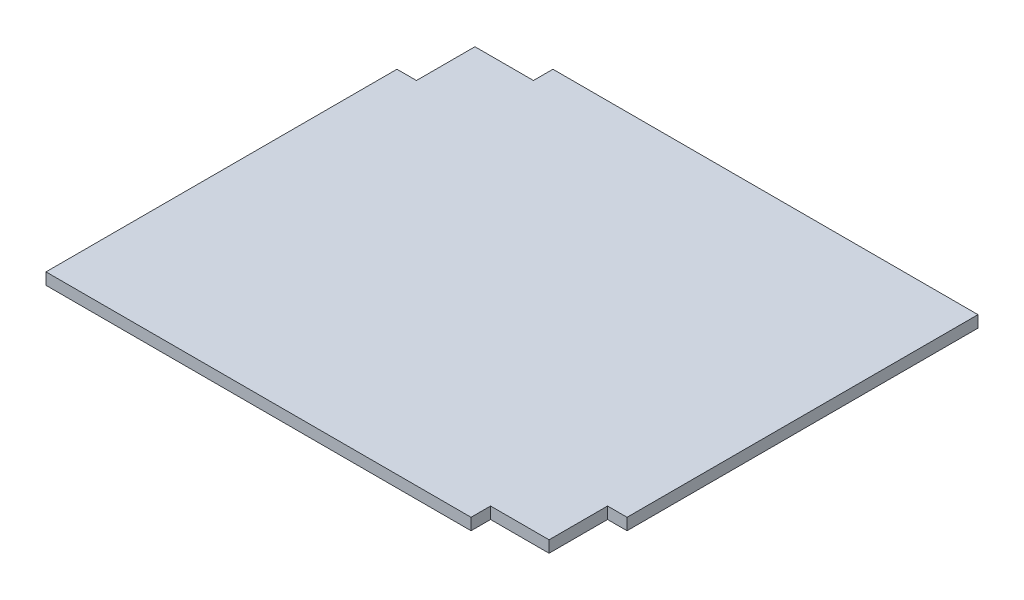
ISO-10303-21;
HEADER;
FILE_DESCRIPTION(('STEP AP214'),'2;1');
FILE_NAME('part.step','',(''),(''),'','','');
FILE_SCHEMA(('AUTOMOTIVE_DESIGN { 1 0 10303 214 1 1 1 1 }'));
ENDSEC;
DATA;
#1=APPLICATION_CONTEXT('core data for automotive mechanical design processes');
#2=APPLICATION_PROTOCOL_DEFINITION('international standard','automotive_design',2000,#1);
#3=PRODUCT_CONTEXT('',#1,'mechanical');
#4=PRODUCT('Part','Part','',(#3));
#5=PRODUCT_RELATED_PRODUCT_CATEGORY('part','',(#4));
#6=PRODUCT_DEFINITION_FORMATION('','',#4);
#7=PRODUCT_DEFINITION_CONTEXT('part definition',#1,'design');
#8=PRODUCT_DEFINITION('design','',#6,#7);
#9=PRODUCT_DEFINITION_SHAPE('','',#8);
#10=(LENGTH_UNIT() NAMED_UNIT(*) SI_UNIT(.MILLI.,.METRE.));
#11=(NAMED_UNIT(*) PLANE_ANGLE_UNIT() SI_UNIT($,.RADIAN.));
#12=(NAMED_UNIT(*) SI_UNIT($,.STERADIAN.) SOLID_ANGLE_UNIT());
#13=UNCERTAINTY_MEASURE_WITH_UNIT(LENGTH_MEASURE(1.E-05),#10,'distance_accuracy_value','');
#14=(GEOMETRIC_REPRESENTATION_CONTEXT(3) GLOBAL_UNCERTAINTY_ASSIGNED_CONTEXT((#13)) GLOBAL_UNIT_ASSIGNED_CONTEXT((#10,
#11,#12)) REPRESENTATION_CONTEXT('',''));
#15=CARTESIAN_POINT('',(0.,0.,0.));
#16=DIRECTION('',(0.,0.,1.));
#17=DIRECTION('',(1.,0.,0.));
#18=AXIS2_PLACEMENT_3D('',#15,#16,#17);
#19=CARTESIAN_POINT('',(32.25,1.5,-27.5));
#20=DIRECTION('',(0.,0.,1.));
#21=DIRECTION('',(1.,0.,0.));
#22=AXIS2_PLACEMENT_3D('',#19,#20,#21);
#23=PLANE('',#22);
#24=DIRECTION('',(-1.,0.,0.));
#25=VECTOR('',#24,1.);
#26=CARTESIAN_POINT('',(32.25,0.,-27.5));
#27=LINE('',#26,#25);
#28=CARTESIAN_POINT('',(32.25,0.,-27.5));
#29=VERTEX_POINT('',#28);
#30=CARTESIAN_POINT('',(-22.25,0.,-27.5));
#31=VERTEX_POINT('',#30);
#32=EDGE_CURVE('E164',#29,#31,#27,.T.);
#33=ORIENTED_EDGE('',*,*,#32,.T.);
#34=DIRECTION('',(0.,-1.,0.));
#35=VECTOR('',#34,1.);
#36=CARTESIAN_POINT('',(-22.25,1.5,-27.5));
#37=LINE('',#36,#35);
#38=CARTESIAN_POINT('',(-22.25,1.5,-27.5));
#39=VERTEX_POINT('',#38);
#40=EDGE_CURVE('E11',#39,#31,#37,.T.);
#41=ORIENTED_EDGE('',*,*,#40,.F.);
#42=DIRECTION('',(-1.,0.,0.));
#43=VECTOR('',#42,1.);
#44=CARTESIAN_POINT('',(32.25,1.5,-27.5));
#45=LINE('',#44,#43);
#46=CARTESIAN_POINT('',(32.25,1.5,-27.5));
#47=VERTEX_POINT('',#46);
#48=EDGE_CURVE('E198',#47,#39,#45,.T.);
#49=ORIENTED_EDGE('',*,*,#48,.F.);
#50=DIRECTION('',(0.,-1.,0.));
#51=VECTOR('',#50,1.);
#52=CARTESIAN_POINT('',(32.25,1.5,-27.5));
#53=LINE('',#52,#51);
#54=EDGE_CURVE('E160',#47,#29,#53,.T.);
#55=ORIENTED_EDGE('',*,*,#54,.T.);
#56=EDGE_LOOP('',(#33,#41,#49,#55));
#57=FACE_BOUND('',#56,.T.);
#58=ADVANCED_FACE('F39',(#57),#23,.F.);
#59=CARTESIAN_POINT('',(-22.25,1.5,-27.5));
#60=DIRECTION('',(1.,0.,0.));
#61=DIRECTION('',(0.,0.,-1.));
#62=AXIS2_PLACEMENT_3D('',#59,#60,#61);
#63=PLANE('',#62);
#64=DIRECTION('',(0.,0.,1.));
#65=VECTOR('',#64,1.);
#66=CARTESIAN_POINT('',(-22.25,0.,-27.5));
#67=LINE('',#66,#65);
#68=CARTESIAN_POINT('',(-22.25,0.,-25.));
#69=VERTEX_POINT('',#68);
#70=EDGE_CURVE('E168',#31,#69,#67,.T.);
#71=ORIENTED_EDGE('',*,*,#70,.T.);
#72=DIRECTION('',(0.,-1.,0.));
#73=VECTOR('',#72,1.);
#74=CARTESIAN_POINT('',(-22.25,1.5,-25.));
#75=LINE('',#74,#73);
#76=CARTESIAN_POINT('',(-22.25,1.5,-25.));
#77=VERTEX_POINT('',#76);
#78=EDGE_CURVE('E48',#77,#69,#75,.T.);
#79=ORIENTED_EDGE('',*,*,#78,.F.);
#80=DIRECTION('',(0.,0.,1.));
#81=VECTOR('',#80,1.);
#82=CARTESIAN_POINT('',(-22.25,1.5,-27.5));
#83=LINE('',#82,#81);
#84=EDGE_CURVE('E111',#39,#77,#83,.T.);
#85=ORIENTED_EDGE('',*,*,#84,.F.);
#86=ORIENTED_EDGE('',*,*,#40,.T.);
#87=EDGE_LOOP('',(#71,#79,#85,#86));
#88=FACE_BOUND('',#87,.T.);
#89=ADVANCED_FACE('F292',(#88),#63,.F.);
#90=CARTESIAN_POINT('',(-29.75,1.5,-25.));
#91=DIRECTION('',(0.,0.,1.));
#92=DIRECTION('',(1.,0.,0.));
#93=AXIS2_PLACEMENT_3D('',#90,#91,#92);
#94=PLANE('',#93);
#95=DIRECTION('',(-1.,0.,0.));
#96=VECTOR('',#95,1.);
#97=CARTESIAN_POINT('',(-29.75,0.,-25.));
#98=LINE('',#97,#96);
#99=CARTESIAN_POINT('',(-29.75,0.,-25.));
#100=VERTEX_POINT('',#99);
#101=EDGE_CURVE('E171',#69,#100,#98,.T.);
#102=ORIENTED_EDGE('',*,*,#101,.T.);
#103=DIRECTION('',(0.,-1.,0.));
#104=VECTOR('',#103,1.);
#105=CARTESIAN_POINT('',(-29.75,1.5,-25.));
#106=LINE('',#105,#104);
#107=CARTESIAN_POINT('',(-29.75,1.5,-25.));
#108=VERTEX_POINT('',#107);
#109=EDGE_CURVE('E225',#108,#100,#106,.T.);
#110=ORIENTED_EDGE('',*,*,#109,.F.);
#111=DIRECTION('',(-1.,0.,0.));
#112=VECTOR('',#111,1.);
#113=CARTESIAN_POINT('',(-29.75,1.5,-25.));
#114=LINE('',#113,#112);
#115=EDGE_CURVE('E235',#77,#108,#114,.T.);
#116=ORIENTED_EDGE('',*,*,#115,.F.);
#117=ORIENTED_EDGE('',*,*,#78,.T.);
#118=EDGE_LOOP('',(#102,#110,#116,#117));
#119=FACE_BOUND('',#118,.T.);
#120=ADVANCED_FACE('F233',(#119),#94,.F.);
#121=CARTESIAN_POINT('',(-29.75,1.5,-25.));
#122=DIRECTION('',(1.,0.,0.));
#123=DIRECTION('',(0.,0.,-1.));
#124=AXIS2_PLACEMENT_3D('',#121,#122,#123);
#125=PLANE('',#124);
#126=DIRECTION('',(0.,0.,1.));
#127=VECTOR('',#126,1.);
#128=CARTESIAN_POINT('',(-29.75,0.,-25.));
#129=LINE('',#128,#127);
#130=CARTESIAN_POINT('',(-29.75,0.,-17.5));
#131=VERTEX_POINT('',#130);
#132=EDGE_CURVE('E174',#100,#131,#129,.T.);
#133=ORIENTED_EDGE('',*,*,#132,.T.);
#134=DIRECTION('',(0.,-1.,0.));
#135=VECTOR('',#134,1.);
#136=CARTESIAN_POINT('',(-29.75,1.5,-17.5));
#137=LINE('',#136,#135);
#138=CARTESIAN_POINT('',(-29.75,1.5,-17.5));
#139=VERTEX_POINT('',#138);
#140=EDGE_CURVE('E221',#139,#131,#137,.T.);
#141=ORIENTED_EDGE('',*,*,#140,.F.);
#142=DIRECTION('',(0.,0.,1.));
#143=VECTOR('',#142,1.);
#144=CARTESIAN_POINT('',(-29.75,1.5,-25.));
#145=LINE('',#144,#143);
#146=EDGE_CURVE('E254',#108,#139,#145,.T.);
#147=ORIENTED_EDGE('',*,*,#146,.F.);
#148=ORIENTED_EDGE('',*,*,#109,.T.);
#149=EDGE_LOOP('',(#133,#141,#147,#148));
#150=FACE_BOUND('',#149,.T.);
#151=ADVANCED_FACE('F244',(#150),#125,.F.);
#152=CARTESIAN_POINT('',(-32.25,1.5,-17.5));
#153=DIRECTION('',(0.,0.,1.));
#154=DIRECTION('',(1.,0.,0.));
#155=AXIS2_PLACEMENT_3D('',#152,#153,#154);
#156=PLANE('',#155);
#157=DIRECTION('',(-1.,0.,0.));
#158=VECTOR('',#157,1.);
#159=CARTESIAN_POINT('',(-32.25,0.,-17.5));
#160=LINE('',#159,#158);
#161=CARTESIAN_POINT('',(-32.25,0.,-17.5));
#162=VERTEX_POINT('',#161);
#163=EDGE_CURVE('E177',#131,#162,#160,.T.);
#164=ORIENTED_EDGE('',*,*,#163,.T.);
#165=DIRECTION('',(0.,-1.,0.));
#166=VECTOR('',#165,1.);
#167=CARTESIAN_POINT('',(-32.25,1.5,-17.5));
#168=LINE('',#167,#166);
#169=CARTESIAN_POINT('',(-32.25,1.5,-17.5));
#170=VERTEX_POINT('',#169);
#171=EDGE_CURVE('E217',#170,#162,#168,.T.);
#172=ORIENTED_EDGE('',*,*,#171,.F.);
#173=DIRECTION('',(-1.,0.,0.));
#174=VECTOR('',#173,1.);
#175=CARTESIAN_POINT('',(-32.25,1.5,-17.5));
#176=LINE('',#175,#174);
#177=EDGE_CURVE('E250',#139,#170,#176,.T.);
#178=ORIENTED_EDGE('',*,*,#177,.F.);
#179=ORIENTED_EDGE('',*,*,#140,.T.);
#180=EDGE_LOOP('',(#164,#172,#178,#179));
#181=FACE_BOUND('',#180,.T.);
#182=ADVANCED_FACE('F248',(#181),#156,.F.);
#183=CARTESIAN_POINT('',(-32.25,1.5,27.5));
#184=DIRECTION('',(1.,0.,0.));
#185=DIRECTION('',(0.,0.,-1.));
#186=AXIS2_PLACEMENT_3D('',#183,#184,#185);
#187=PLANE('',#186);
#188=DIRECTION('',(0.,0.,1.));
#189=VECTOR('',#188,1.);
#190=CARTESIAN_POINT('',(-32.25,0.,27.5));
#191=LINE('',#190,#189);
#192=CARTESIAN_POINT('',(-32.25,0.,27.5));
#193=VERTEX_POINT('',#192);
#194=EDGE_CURVE('E180',#162,#193,#191,.T.);
#195=ORIENTED_EDGE('',*,*,#194,.T.);
#196=DIRECTION('',(0.,-1.,0.));
#197=VECTOR('',#196,1.);
#198=CARTESIAN_POINT('',(-32.25,1.5,27.5));
#199=LINE('',#198,#197);
#200=CARTESIAN_POINT('',(-32.25,1.5,27.5));
#201=VERTEX_POINT('',#200);
#202=EDGE_CURVE('E213',#201,#193,#199,.T.);
#203=ORIENTED_EDGE('',*,*,#202,.F.);
#204=DIRECTION('',(0.,0.,1.));
#205=VECTOR('',#204,1.);
#206=CARTESIAN_POINT('',(-32.25,1.5,27.5));
#207=LINE('',#206,#205);
#208=EDGE_CURVE('E253',#170,#201,#207,.T.);
#209=ORIENTED_EDGE('',*,*,#208,.F.);
#210=ORIENTED_EDGE('',*,*,#171,.T.);
#211=EDGE_LOOP('',(#195,#203,#209,#210));
#212=FACE_BOUND('',#211,.T.);
#213=ADVANCED_FACE('F305',(#212),#187,.F.);
#214=CARTESIAN_POINT('',(22.25,1.5,27.5));
#215=DIRECTION('',(0.,0.,-1.));
#216=DIRECTION('',(-1.,0.,0.));
#217=AXIS2_PLACEMENT_3D('',#214,#215,#216);
#218=PLANE('',#217);
#219=DIRECTION('',(1.,0.,0.));
#220=VECTOR('',#219,1.);
#221=CARTESIAN_POINT('',(22.25,0.,27.5));
#222=LINE('',#221,#220);
#223=CARTESIAN_POINT('',(22.25,0.,27.5));
#224=VERTEX_POINT('',#223);
#225=EDGE_CURVE('E183',#193,#224,#222,.T.);
#226=ORIENTED_EDGE('',*,*,#225,.T.);
#227=DIRECTION('',(0.,-1.,0.));
#228=VECTOR('',#227,1.);
#229=CARTESIAN_POINT('',(22.25,1.5,27.5));
#230=LINE('',#229,#228);
#231=CARTESIAN_POINT('',(22.25,1.5,27.5));
#232=VERTEX_POINT('',#231);
#233=EDGE_CURVE('E209',#232,#224,#230,.T.);
#234=ORIENTED_EDGE('',*,*,#233,.F.);
#235=DIRECTION('',(1.,0.,0.));
#236=VECTOR('',#235,1.);
#237=CARTESIAN_POINT('',(22.25,1.5,27.5));
#238=LINE('',#237,#236);
#239=EDGE_CURVE('E258',#201,#232,#238,.T.);
#240=ORIENTED_EDGE('',*,*,#239,.F.);
#241=ORIENTED_EDGE('',*,*,#202,.T.);
#242=EDGE_LOOP('',(#226,#234,#240,#241));
#243=FACE_BOUND('',#242,.T.);
#244=ADVANCED_FACE('F308',(#243),#218,.F.);
#245=CARTESIAN_POINT('',(22.25,1.5,27.5));
#246=DIRECTION('',(-1.,0.,0.));
#247=DIRECTION('',(0.,0.,1.));
#248=AXIS2_PLACEMENT_3D('',#245,#246,#247);
#249=PLANE('',#248);
#250=DIRECTION('',(0.,0.,-1.));
#251=VECTOR('',#250,1.);
#252=CARTESIAN_POINT('',(22.25,0.,27.5));
#253=LINE('',#252,#251);
#254=CARTESIAN_POINT('',(22.25,0.,25.));
#255=VERTEX_POINT('',#254);
#256=EDGE_CURVE('E186',#224,#255,#253,.T.);
#257=ORIENTED_EDGE('',*,*,#256,.T.);
#258=DIRECTION('',(0.,-1.,0.));
#259=VECTOR('',#258,1.);
#260=CARTESIAN_POINT('',(22.25,1.5,25.));
#261=LINE('',#260,#259);
#262=CARTESIAN_POINT('',(22.25,1.5,25.));
#263=VERTEX_POINT('',#262);
#264=EDGE_CURVE('E205',#263,#255,#261,.T.);
#265=ORIENTED_EDGE('',*,*,#264,.F.);
#266=DIRECTION('',(0.,0.,-1.));
#267=VECTOR('',#266,1.);
#268=CARTESIAN_POINT('',(22.25,1.5,27.5));
#269=LINE('',#268,#267);
#270=EDGE_CURVE('E265',#232,#263,#269,.T.);
#271=ORIENTED_EDGE('',*,*,#270,.F.);
#272=ORIENTED_EDGE('',*,*,#233,.T.);
#273=EDGE_LOOP('',(#257,#265,#271,#272));
#274=FACE_BOUND('',#273,.T.);
#275=ADVANCED_FACE('F273',(#274),#249,.F.);
#276=CARTESIAN_POINT('',(22.25,1.5,25.));
#277=DIRECTION('',(0.,0.,-1.));
#278=DIRECTION('',(-1.,0.,0.));
#279=AXIS2_PLACEMENT_3D('',#276,#277,#278);
#280=PLANE('',#279);
#281=DIRECTION('',(1.,0.,0.));
#282=VECTOR('',#281,1.);
#283=CARTESIAN_POINT('',(22.25,0.,25.));
#284=LINE('',#283,#282);
#285=CARTESIAN_POINT('',(29.75,0.,25.));
#286=VERTEX_POINT('',#285);
#287=EDGE_CURVE('E189',#255,#286,#284,.T.);
#288=ORIENTED_EDGE('',*,*,#287,.T.);
#289=DIRECTION('',(0.,-1.,0.));
#290=VECTOR('',#289,1.);
#291=CARTESIAN_POINT('',(29.75,1.5,25.));
#292=LINE('',#291,#290);
#293=CARTESIAN_POINT('',(29.75,1.5,25.));
#294=VERTEX_POINT('',#293);
#295=EDGE_CURVE('E153',#294,#286,#292,.T.);
#296=ORIENTED_EDGE('',*,*,#295,.F.);
#297=DIRECTION('',(1.,0.,0.));
#298=VECTOR('',#297,1.);
#299=CARTESIAN_POINT('',(22.25,1.5,25.));
#300=LINE('',#299,#298);
#301=EDGE_CURVE('E142',#263,#294,#300,.T.);
#302=ORIENTED_EDGE('',*,*,#301,.F.);
#303=ORIENTED_EDGE('',*,*,#264,.T.);
#304=EDGE_LOOP('',(#288,#296,#302,#303));
#305=FACE_BOUND('',#304,.T.);
#306=ADVANCED_FACE('F277',(#305),#280,.F.);
#307=CARTESIAN_POINT('',(29.75,1.5,25.));
#308=DIRECTION('',(-1.,0.,0.));
#309=DIRECTION('',(0.,0.,1.));
#310=AXIS2_PLACEMENT_3D('',#307,#308,#309);
#311=PLANE('',#310);
#312=DIRECTION('',(0.,0.,-1.));
#313=VECTOR('',#312,1.);
#314=CARTESIAN_POINT('',(29.75,0.,25.));
#315=LINE('',#314,#313);
#316=CARTESIAN_POINT('',(29.75,0.,17.5));
#317=VERTEX_POINT('',#316);
#318=EDGE_CURVE('E151',#286,#317,#315,.T.);
#319=ORIENTED_EDGE('',*,*,#318,.T.);
#320=DIRECTION('',(0.,-1.,0.));
#321=VECTOR('',#320,1.);
#322=CARTESIAN_POINT('',(29.75,1.5,17.5));
#323=LINE('',#322,#321);
#324=CARTESIAN_POINT('',(29.75,1.5,17.5));
#325=VERTEX_POINT('',#324);
#326=EDGE_CURVE('E148',#325,#317,#323,.T.);
#327=ORIENTED_EDGE('',*,*,#326,.F.);
#328=DIRECTION('',(0.,0.,-1.));
#329=VECTOR('',#328,1.);
#330=CARTESIAN_POINT('',(29.75,1.5,25.));
#331=LINE('',#330,#329);
#332=EDGE_CURVE('E136',#294,#325,#331,.T.);
#333=ORIENTED_EDGE('',*,*,#332,.F.);
#334=ORIENTED_EDGE('',*,*,#295,.T.);
#335=EDGE_LOOP('',(#319,#327,#333,#334));
#336=FACE_BOUND('',#335,.T.);
#337=ADVANCED_FACE('F149',(#336),#311,.F.);
#338=CARTESIAN_POINT('',(29.75,1.5,17.5));
#339=DIRECTION('',(0.,0.,-1.));
#340=DIRECTION('',(-1.,0.,0.));
#341=AXIS2_PLACEMENT_3D('',#338,#339,#340);
#342=PLANE('',#341);
#343=DIRECTION('',(1.,0.,0.));
#344=VECTOR('',#343,1.);
#345=CARTESIAN_POINT('',(29.75,0.,17.5));
#346=LINE('',#345,#344);
#347=CARTESIAN_POINT('',(32.25,0.,17.5));
#348=VERTEX_POINT('',#347);
#349=EDGE_CURVE('E97',#317,#348,#346,.T.);
#350=ORIENTED_EDGE('',*,*,#349,.T.);
#351=DIRECTION('',(0.,-1.,0.));
#352=VECTOR('',#351,1.);
#353=CARTESIAN_POINT('',(32.25,1.5,17.5));
#354=LINE('',#353,#352);
#355=CARTESIAN_POINT('',(32.25,1.5,17.5));
#356=VERTEX_POINT('',#355);
#357=EDGE_CURVE('E154',#356,#348,#354,.T.);
#358=ORIENTED_EDGE('',*,*,#357,.F.);
#359=DIRECTION('',(1.,0.,0.));
#360=VECTOR('',#359,1.);
#361=CARTESIAN_POINT('',(29.75,1.5,17.5));
#362=LINE('',#361,#360);
#363=EDGE_CURVE('E140',#325,#356,#362,.T.);
#364=ORIENTED_EDGE('',*,*,#363,.F.);
#365=ORIENTED_EDGE('',*,*,#326,.T.);
#366=EDGE_LOOP('',(#350,#358,#364,#365));
#367=FACE_BOUND('',#366,.T.);
#368=ADVANCED_FACE('F156',(#367),#342,.F.);
#369=CARTESIAN_POINT('',(32.25,1.5,17.5));
#370=DIRECTION('',(-1.,0.,0.));
#371=DIRECTION('',(0.,0.,1.));
#372=AXIS2_PLACEMENT_3D('',#369,#370,#371);
#373=PLANE('',#372);
#374=DIRECTION('',(0.,0.,-1.));
#375=VECTOR('',#374,1.);
#376=CARTESIAN_POINT('',(32.25,0.,17.5));
#377=LINE('',#376,#375);
#378=EDGE_CURVE('E103',#348,#29,#377,.T.);
#379=ORIENTED_EDGE('',*,*,#378,.T.);
#380=ORIENTED_EDGE('',*,*,#54,.F.);
#381=DIRECTION('',(0.,0.,-1.));
#382=VECTOR('',#381,1.);
#383=CARTESIAN_POINT('',(32.25,1.5,17.5));
#384=LINE('',#383,#382);
#385=EDGE_CURVE('E56',#356,#47,#384,.T.);
#386=ORIENTED_EDGE('',*,*,#385,.F.);
#387=ORIENTED_EDGE('',*,*,#357,.T.);
#388=EDGE_LOOP('',(#379,#380,#386,#387));
#389=FACE_BOUND('',#388,.T.);
#390=ADVANCED_FACE('F281',(#389),#373,.F.);
#391=CARTESIAN_POINT('',(0.,1.5,0.));
#392=DIRECTION('',(0.,1.,0.));
#393=DIRECTION('',(0.,0.,1.));
#394=AXIS2_PLACEMENT_3D('',#391,#392,#393);
#395=PLANE('',#394);
#396=ORIENTED_EDGE('',*,*,#48,.T.);
#397=ORIENTED_EDGE('',*,*,#84,.T.);
#398=ORIENTED_EDGE('',*,*,#115,.T.);
#399=ORIENTED_EDGE('',*,*,#146,.T.);
#400=ORIENTED_EDGE('',*,*,#177,.T.);
#401=ORIENTED_EDGE('',*,*,#208,.T.);
#402=ORIENTED_EDGE('',*,*,#239,.T.);
#403=ORIENTED_EDGE('',*,*,#270,.T.);
#404=ORIENTED_EDGE('',*,*,#301,.T.);
#405=ORIENTED_EDGE('',*,*,#332,.T.);
#406=ORIENTED_EDGE('',*,*,#363,.T.);
#407=ORIENTED_EDGE('',*,*,#385,.T.);
#408=EDGE_LOOP('',(#396,#397,#398,#399,#400,#401,#402,#403,#404,#405,#406,#407));
#409=FACE_BOUND('',#408,.T.);
#410=ADVANCED_FACE('F138',(#409),#395,.T.);
#411=CARTESIAN_POINT('',(0.,0.,0.));
#412=DIRECTION('',(0.,1.,0.));
#413=DIRECTION('',(0.,0.,1.));
#414=AXIS2_PLACEMENT_3D('',#411,#412,#413);
#415=PLANE('',#414);
#416=ORIENTED_EDGE('',*,*,#32,.F.);
#417=ORIENTED_EDGE('',*,*,#378,.F.);
#418=ORIENTED_EDGE('',*,*,#349,.F.);
#419=ORIENTED_EDGE('',*,*,#318,.F.);
#420=ORIENTED_EDGE('',*,*,#287,.F.);
#421=ORIENTED_EDGE('',*,*,#256,.F.);
#422=ORIENTED_EDGE('',*,*,#225,.F.);
#423=ORIENTED_EDGE('',*,*,#194,.F.);
#424=ORIENTED_EDGE('',*,*,#163,.F.);
#425=ORIENTED_EDGE('',*,*,#132,.F.);
#426=ORIENTED_EDGE('',*,*,#101,.F.);
#427=ORIENTED_EDGE('',*,*,#70,.F.);
#428=EDGE_LOOP('',(#416,#417,#418,#419,#420,#421,#422,#423,#424,#425,#426,#427));
#429=FACE_BOUND('',#428,.T.);
#430=ADVANCED_FACE('F239',(#429),#415,.F.);
#431=CLOSED_SHELL('',(#58,#89,#120,#151,#182,#213,#244,#275,#306,#337,#368,#390,#410,#430));
#432=MANIFOLD_SOLID_BREP('B2',#431);
#433=ADVANCED_BREP_SHAPE_REPRESENTATION('',(#18,#432),#14);
#434=SHAPE_DEFINITION_REPRESENTATION(#9,#433);
ENDSEC;
END-ISO-10303-21;
